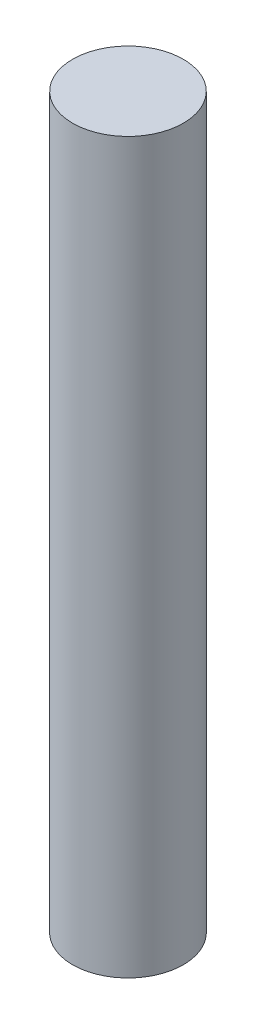
ISO-10303-21;
HEADER;
FILE_DESCRIPTION(('STEP AP214'),'2;1');
FILE_NAME('part.step','',(''),(''),'','','');
FILE_SCHEMA(('AUTOMOTIVE_DESIGN { 1 0 10303 214 1 1 1 1 }'));
ENDSEC;
DATA;
#1=APPLICATION_CONTEXT('core data for automotive mechanical design processes');
#2=APPLICATION_PROTOCOL_DEFINITION('international standard','automotive_design',2000,#1);
#3=PRODUCT_CONTEXT('',#1,'mechanical');
#4=PRODUCT('Part','Part','',(#3));
#5=PRODUCT_RELATED_PRODUCT_CATEGORY('part','',(#4));
#6=PRODUCT_DEFINITION_FORMATION('','',#4);
#7=PRODUCT_DEFINITION_CONTEXT('part definition',#1,'design');
#8=PRODUCT_DEFINITION('design','',#6,#7);
#9=PRODUCT_DEFINITION_SHAPE('','',#8);
#10=(LENGTH_UNIT() NAMED_UNIT(*) SI_UNIT(.MILLI.,.METRE.));
#11=(NAMED_UNIT(*) PLANE_ANGLE_UNIT() SI_UNIT($,.RADIAN.));
#12=(NAMED_UNIT(*) SI_UNIT($,.STERADIAN.) SOLID_ANGLE_UNIT());
#13=UNCERTAINTY_MEASURE_WITH_UNIT(LENGTH_MEASURE(1.E-05),#10,'distance_accuracy_value','');
#14=(GEOMETRIC_REPRESENTATION_CONTEXT(3) GLOBAL_UNCERTAINTY_ASSIGNED_CONTEXT((#13)) GLOBAL_UNIT_ASSIGNED_CONTEXT((#10,
#11,#12)) REPRESENTATION_CONTEXT('',''));
#15=CARTESIAN_POINT('',(0.,0.,0.));
#16=DIRECTION('',(0.,0.,1.));
#17=DIRECTION('',(1.,0.,0.));
#18=AXIS2_PLACEMENT_3D('',#15,#16,#17);
#19=CARTESIAN_POINT('',(0.,63.5,0.));
#20=DIRECTION('',(0.,-1.,0.));
#21=DIRECTION('',(0.,0.,-1.));
#22=AXIS2_PLACEMENT_3D('',#19,#20,#21);
#23=CYLINDRICAL_SURFACE('',#22,4.826);
#24=CARTESIAN_POINT('',(0.,63.5,0.));
#25=DIRECTION('',(0.,1.,0.));
#26=DIRECTION('',(0.,0.,1.));
#27=AXIS2_PLACEMENT_3D('',#24,#25,#26);
#28=CIRCLE('',#27,4.826);
#29=CARTESIAN_POINT('',(0.,63.5,4.826));
#30=VERTEX_POINT('',#29);
#31=EDGE_CURVE('E10',#30,#30,#28,.T.);
#32=ORIENTED_EDGE('',*,*,#31,.F.);
#33=EDGE_LOOP('',(#32));
#34=FACE_BOUND('',#33,.T.);
#35=CARTESIAN_POINT('',(0.,0.,0.));
#36=DIRECTION('',(0.,1.,0.));
#37=DIRECTION('',(0.,0.,1.));
#38=AXIS2_PLACEMENT_3D('',#35,#36,#37);
#39=CIRCLE('',#38,4.826);
#40=CARTESIAN_POINT('',(0.,0.,4.826));
#41=VERTEX_POINT('',#40);
#42=EDGE_CURVE('E34',#41,#41,#39,.T.);
#43=ORIENTED_EDGE('',*,*,#42,.T.);
#44=EDGE_LOOP('',(#43));
#45=FACE_BOUND('',#44,.T.);
#46=ADVANCED_FACE('F31',(#34,#45),#23,.T.);
#47=CARTESIAN_POINT('',(0.,63.5,0.));
#48=DIRECTION('',(0.,1.,0.));
#49=DIRECTION('',(0.,0.,1.));
#50=AXIS2_PLACEMENT_3D('',#47,#48,#49);
#51=PLANE('',#50);
#52=ORIENTED_EDGE('',*,*,#31,.T.);
#53=EDGE_LOOP('',(#52));
#54=FACE_BOUND('',#53,.T.);
#55=ADVANCED_FACE('F46',(#54),#51,.T.);
#56=CARTESIAN_POINT('',(0.,0.,0.));
#57=DIRECTION('',(0.,1.,0.));
#58=DIRECTION('',(0.,0.,1.));
#59=AXIS2_PLACEMENT_3D('',#56,#57,#58);
#60=PLANE('',#59);
#61=ORIENTED_EDGE('',*,*,#42,.F.);
#62=EDGE_LOOP('',(#61));
#63=FACE_BOUND('',#62,.T.);
#64=ADVANCED_FACE('F44',(#63),#60,.F.);
#65=CLOSED_SHELL('',(#46,#55,#64));
#66=MANIFOLD_SOLID_BREP('B2',#65);
#67=ADVANCED_BREP_SHAPE_REPRESENTATION('',(#18,#66),#14);
#68=SHAPE_DEFINITION_REPRESENTATION(#9,#67);
ENDSEC;
END-ISO-10303-21;
